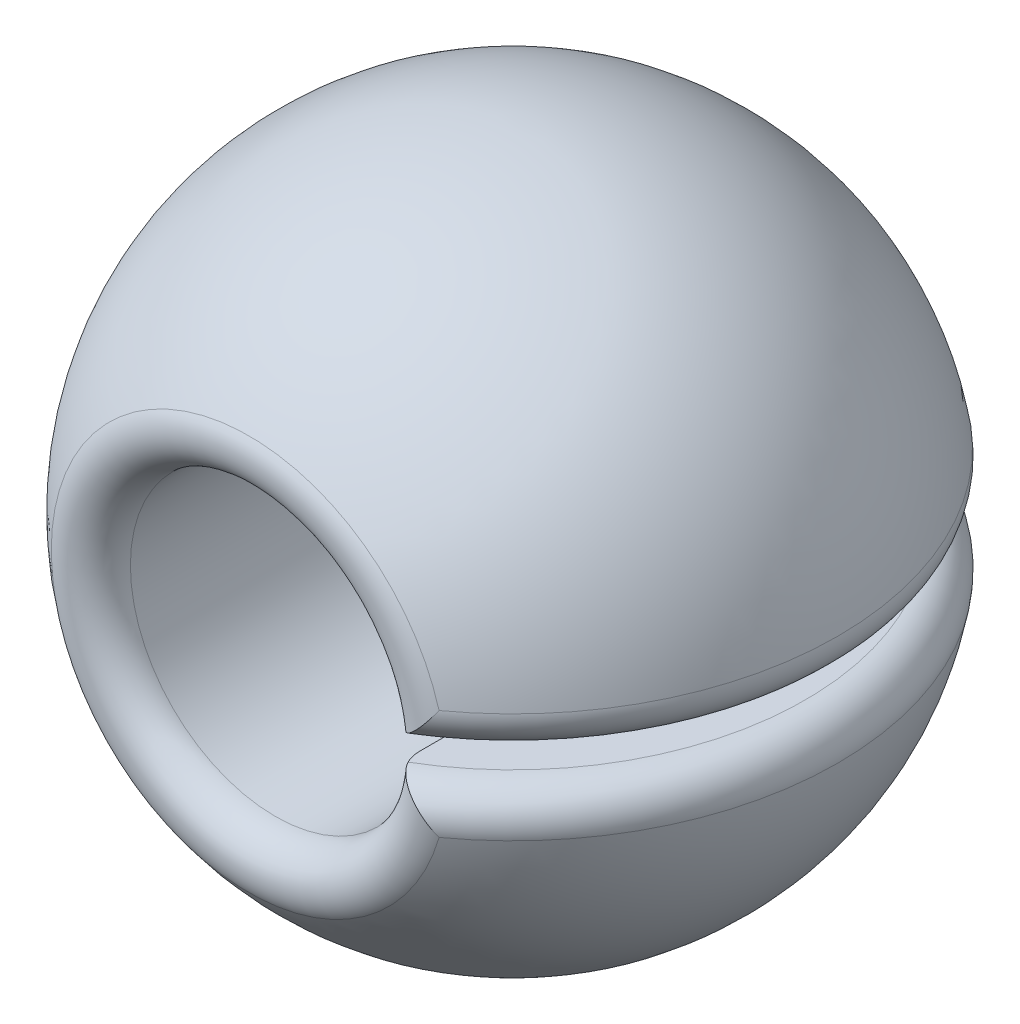
ISO-10303-21;
HEADER;
FILE_DESCRIPTION(('STEP AP214'),'2;1');
FILE_NAME('part.step','',(''),(''),'','','');
FILE_SCHEMA(('AUTOMOTIVE_DESIGN { 1 0 10303 214 1 1 1 1 }'));
ENDSEC;
DATA;
#1=APPLICATION_CONTEXT('core data for automotive mechanical design processes');
#2=APPLICATION_PROTOCOL_DEFINITION('international standard','automotive_design',2000,#1);
#3=PRODUCT_CONTEXT('',#1,'mechanical');
#4=PRODUCT('Part','Part','',(#3));
#5=PRODUCT_RELATED_PRODUCT_CATEGORY('part','',(#4));
#6=PRODUCT_DEFINITION_FORMATION('','',#4);
#7=PRODUCT_DEFINITION_CONTEXT('part definition',#1,'design');
#8=PRODUCT_DEFINITION('design','',#6,#7);
#9=PRODUCT_DEFINITION_SHAPE('','',#8);
#10=(LENGTH_UNIT() NAMED_UNIT(*) SI_UNIT(.MILLI.,.METRE.));
#11=(NAMED_UNIT(*) PLANE_ANGLE_UNIT() SI_UNIT($,.RADIAN.));
#12=(NAMED_UNIT(*) SI_UNIT($,.STERADIAN.) SOLID_ANGLE_UNIT());
#13=UNCERTAINTY_MEASURE_WITH_UNIT(LENGTH_MEASURE(1.E-05),#10,'distance_accuracy_value','');
#14=(GEOMETRIC_REPRESENTATION_CONTEXT(3) GLOBAL_UNCERTAINTY_ASSIGNED_CONTEXT((#13)) GLOBAL_UNIT_ASSIGNED_CONTEXT((#10,
#11,#12)) REPRESENTATION_CONTEXT('',''));
#15=CARTESIAN_POINT('',(0.,0.,0.));
#16=DIRECTION('',(0.,0.,1.));
#17=DIRECTION('',(1.,0.,0.));
#18=AXIS2_PLACEMENT_3D('',#15,#16,#17);
#19=CARTESIAN_POINT('',(0.,0.,0.));
#20=DIRECTION('',(0.,1.,0.));
#21=DIRECTION('',(1.,0.,0.));
#22=AXIS2_PLACEMENT_3D('',#19,#20,#21);
#23=SPHERICAL_SURFACE('',#22,10.);
#24=CARTESIAN_POINT('',(0.,-1.66666666666667,0.));
#25=DIRECTION('',(0.,1.,0.));
#26=DIRECTION('',(0.,0.,1.));
#27=AXIS2_PLACEMENT_3D('',#24,#25,#26);
#28=CIRCLE('',#27,9.86013297183269);
#29=CARTESIAN_POINT('',(5.76387215526353,-1.66666666666666,-8.));
#30=VERTEX_POINT('',#29);
#31=CARTESIAN_POINT('',(5.76387215526353,-1.66666666666667,8.));
#32=VERTEX_POINT('',#31);
#33=EDGE_CURVE('E183',#30,#32,#28,.F.);
#34=ORIENTED_EDGE('',*,*,#33,.T.);
#35=CARTESIAN_POINT('',(0.,0.,8.));
#36=DIRECTION('',(0.,0.,-1.));
#37=DIRECTION('',(-1.,0.,0.));
#38=AXIS2_PLACEMENT_3D('',#35,#36,#37);
#39=CIRCLE('',#38,6.);
#40=CARTESIAN_POINT('',(5.76387215526353,1.66666666666667,8.));
#41=VERTEX_POINT('',#40);
#42=EDGE_CURVE('E109',#32,#41,#39,.T.);
#43=ORIENTED_EDGE('',*,*,#42,.T.);
#44=CARTESIAN_POINT('',(0.,1.66666666666667,0.));
#45=DIRECTION('',(0.,-1.,0.));
#46=DIRECTION('',(0.,0.,-1.));
#47=AXIS2_PLACEMENT_3D('',#44,#45,#46);
#48=CIRCLE('',#47,9.86013297183269);
#49=CARTESIAN_POINT('',(5.76387215526353,1.66666666666667,-8.));
#50=VERTEX_POINT('',#49);
#51=EDGE_CURVE('E145',#41,#50,#48,.F.);
#52=ORIENTED_EDGE('',*,*,#51,.T.);
#53=CARTESIAN_POINT('',(0.,0.,-8.));
#54=DIRECTION('',(0.,0.,1.));
#55=DIRECTION('',(1.,0.,0.));
#56=AXIS2_PLACEMENT_3D('',#53,#54,#55);
#57=CIRCLE('',#56,6.);
#58=EDGE_CURVE('E182',#50,#30,#57,.T.);
#59=ORIENTED_EDGE('',*,*,#58,.T.);
#60=EDGE_LOOP('',(#34,#43,#52,#59));
#61=FACE_BOUND('',#60,.T.);
#62=ADVANCED_FACE('F33',(#61),#23,.T.);
#63=CARTESIAN_POINT('',(0.,0.,-15.));
#64=DIRECTION('',(0.,0.,1.));
#65=DIRECTION('',(1.,0.,0.));
#66=AXIS2_PLACEMENT_3D('',#63,#64,#65);
#67=CYLINDRICAL_SURFACE('',#66,4.4);
#68=DIRECTION('',(0.,0.,1.));
#69=VECTOR('',#68,1.);
#70=CARTESIAN_POINT('',(4.37149859887888,0.5,-15.));
#71=LINE('',#70,#69);
#72=CARTESIAN_POINT('',(4.37149859887888,0.5,-7.2));
#73=VERTEX_POINT('',#72);
#74=CARTESIAN_POINT('',(4.37149859887888,0.5,7.2));
#75=VERTEX_POINT('',#74);
#76=EDGE_CURVE('E94',#73,#75,#71,.T.);
#77=ORIENTED_EDGE('',*,*,#76,.T.);
#78=CARTESIAN_POINT('',(0.,0.,7.2));
#79=DIRECTION('',(0.,0.,-1.));
#80=DIRECTION('',(-1.,0.,0.));
#81=AXIS2_PLACEMENT_3D('',#78,#79,#80);
#82=CIRCLE('',#81,4.4);
#83=CARTESIAN_POINT('',(4.37149859887888,-0.5,7.2));
#84=VERTEX_POINT('',#83);
#85=EDGE_CURVE('E100',#75,#84,#82,.F.);
#86=ORIENTED_EDGE('',*,*,#85,.T.);
#87=DIRECTION('',(0.,0.,1.));
#88=VECTOR('',#87,1.);
#89=CARTESIAN_POINT('',(4.37149859887888,-0.5,-15.));
#90=LINE('',#89,#88);
#91=CARTESIAN_POINT('',(4.37149859887888,-0.5,-7.2));
#92=VERTEX_POINT('',#91);
#93=EDGE_CURVE('E97',#84,#92,#90,.F.);
#94=ORIENTED_EDGE('',*,*,#93,.T.);
#95=CARTESIAN_POINT('',(0.,0.,-7.2));
#96=DIRECTION('',(0.,0.,1.));
#97=DIRECTION('',(1.,0.,0.));
#98=AXIS2_PLACEMENT_3D('',#95,#96,#97);
#99=CIRCLE('',#98,4.4);
#100=EDGE_CURVE('E91',#92,#73,#99,.F.);
#101=ORIENTED_EDGE('',*,*,#100,.T.);
#102=EDGE_LOOP('',(#77,#86,#94,#101));
#103=FACE_BOUND('',#102,.T.);
#104=ADVANCED_FACE('F92',(#103),#67,.F.);
#105=CARTESIAN_POINT('',(1.43663209838354,-0.5,-15.));
#106=DIRECTION('',(0.,-1.,0.));
#107=DIRECTION('',(0.,0.,-1.));
#108=AXIS2_PLACEMENT_3D('',#105,#106,#107);
#109=PLANE('',#108);
#110=ORIENTED_EDGE('',*,*,#93,.F.);
#111=CARTESIAN_POINT('',(4.37149859887888,-0.5,7.2));
#112=CARTESIAN_POINT('',(4.3715000083011,-0.5,7.22827118414177));
#113=CARTESIAN_POINT('',(4.37270647832273,-0.5,7.25652365313391));
#114=CARTESIAN_POINT('',(4.37751985173512,-0.5,7.31282151715412));
#115=CARTESIAN_POINT('',(4.38112660510392,-0.5,7.34086692501313));
#116=CARTESIAN_POINT('',(4.39533532294747,-0.5,7.42329671445946));
#117=CARTESIAN_POINT('',(4.40932861969712,-0.5,7.47715178537061));
#118=CARTESIAN_POINT('',(4.43542649940364,-0.5,7.55150612071078));
#119=CARTESIAN_POINT('',(4.44396522602215,-0.5,7.57332808964728));
#120=CARTESIAN_POINT('',(4.46255567751384,-0.5,7.61631357401517));
#121=CARTESIAN_POINT('',(4.47260715294021,-0.5,7.6374771973124));
#122=CARTESIAN_POINT('',(4.48339485904466,-0.5,7.65827464497664));
#123=B_SPLINE_CURVE_WITH_KNOTS('',3,(#111,#112,#113,#114,#115,#116,#117,#118,#119,#120,#121,
#122),.UNSPECIFIED.,.F.,.F.,(4,2,2,2,2,4),(0.,0.0847505826996807,0.169495868835574,
0.335498168743905,0.405753588422414,0.475997435902578),.UNSPECIFIED.);
#124=CARTESIAN_POINT('',(4.48339485904466,-0.5,7.65827464497663));
#125=VERTEX_POINT('',#124);
#126=EDGE_CURVE('E140',#84,#125,#123,.T.);
#127=ORIENTED_EDGE('',*,*,#126,.T.);
#128=CARTESIAN_POINT('',(0.,-0.5,0.));
#129=DIRECTION('',(0.,-1.,0.));
#130=DIRECTION('',(0.,0.,-1.));
#131=AXIS2_PLACEMENT_3D('',#128,#129,#130);
#132=CIRCLE('',#131,8.87411967464942);
#133=CARTESIAN_POINT('',(4.48339485904466,-0.5,-7.65827464497663));
#134=VERTEX_POINT('',#133);
#135=EDGE_CURVE('E146',#125,#134,#132,.F.);
#136=ORIENTED_EDGE('',*,*,#135,.T.);
#137=CARTESIAN_POINT('',(4.48339485904466,-0.5,-7.65827464497663));
#138=CARTESIAN_POINT('',(4.47037990788513,-0.5,-7.63318475023888));
#139=CARTESIAN_POINT('',(4.45843738200139,-0.5,-7.60755924242167));
#140=CARTESIAN_POINT('',(4.43676487424644,-0.5,-7.55537660446647));
#141=CARTESIAN_POINT('',(4.4270358235886,-0.5,-7.52881908763367));
#142=CARTESIAN_POINT('',(4.40164332402976,-0.5,-7.44911335316665));
#143=CARTESIAN_POINT('',(4.38922781859914,-0.5,-7.39487266359291));
#144=CARTESIAN_POINT('',(4.37812898132568,-0.5,-7.31695927734273));
#145=CARTESIAN_POINT('',(4.37565665475817,-0.5,-7.29375869634919));
#146=CARTESIAN_POINT('',(4.37233539823856,-0.5,-7.24704420654527));
#147=CARTESIAN_POINT('',(4.37150038516548,-0.5,-7.2235293077698));
#148=CARTESIAN_POINT('',(4.37149859887887,-0.5,-7.2));
#149=B_SPLINE_CURVE_WITH_KNOTS('',3,(#137,#138,#139,#140,#141,#142,#143,#144,#145,#146,#147,
#148),.UNSPECIFIED.,.F.,.F.,(4,2,2,2,2,4),(0.,0.0847316911509409,0.169498963444771,
0.335500791361195,0.405453090543883,0.475997438023981),.UNSPECIFIED.);
#150=EDGE_CURVE('E133',#134,#92,#149,.T.);
#151=ORIENTED_EDGE('',*,*,#150,.T.);
#152=EDGE_LOOP('',(#110,#127,#136,#151));
#153=FACE_BOUND('',#152,.T.);
#154=ADVANCED_FACE('F124',(#153),#109,.F.);
#155=CARTESIAN_POINT('',(1.43663209838354,0.5,-15.));
#156=DIRECTION('',(0.,1.,0.));
#157=DIRECTION('',(0.,0.,1.));
#158=AXIS2_PLACEMENT_3D('',#155,#156,#157);
#159=PLANE('',#158);
#160=CARTESIAN_POINT('',(0.,0.5,0.));
#161=DIRECTION('',(0.,1.,0.));
#162=DIRECTION('',(0.,0.,1.));
#163=AXIS2_PLACEMENT_3D('',#160,#161,#162);
#164=CIRCLE('',#163,8.87411967464942);
#165=CARTESIAN_POINT('',(4.48339485904466,0.5,-7.65827464497663));
#166=VERTEX_POINT('',#165);
#167=CARTESIAN_POINT('',(4.48339485904466,0.5,7.65827464497663));
#168=VERTEX_POINT('',#167);
#169=EDGE_CURVE('E53',#166,#168,#164,.F.);
#170=ORIENTED_EDGE('',*,*,#169,.T.);
#171=CARTESIAN_POINT('',(4.48339485904467,0.5,7.65827464497664));
#172=CARTESIAN_POINT('',(4.47037990788514,0.5,7.63318475023889));
#173=CARTESIAN_POINT('',(4.45843738200139,0.5,7.60755924242168));
#174=CARTESIAN_POINT('',(4.43676487424644,0.5,7.55537660446648));
#175=CARTESIAN_POINT('',(4.4270358235886,0.5,7.52881908763368));
#176=CARTESIAN_POINT('',(4.40164332402976,0.5,7.44911335316667));
#177=CARTESIAN_POINT('',(4.38922781859914,0.5,7.39487266359292));
#178=CARTESIAN_POINT('',(4.37812898132568,0.5,7.31695927734274));
#179=CARTESIAN_POINT('',(4.37565665475817,0.5,7.2937586963492));
#180=CARTESIAN_POINT('',(4.37233539823856,0.5,7.24704420654527));
#181=CARTESIAN_POINT('',(4.37150038516548,0.5,7.2235293077698));
#182=CARTESIAN_POINT('',(4.37149859887887,0.5,7.2));
#183=B_SPLINE_CURVE_WITH_KNOTS('',3,(#171,#172,#173,#174,#175,#176,#177,#178,#179,#180,#181,
#182),.UNSPECIFIED.,.F.,.F.,(4,2,2,2,2,4),(0.,0.084731691150942,0.16949896344477,
0.335500791361195,0.40545309054389,0.475997438023992),.UNSPECIFIED.);
#184=EDGE_CURVE('E11',#168,#75,#183,.T.);
#185=ORIENTED_EDGE('',*,*,#184,.T.);
#186=ORIENTED_EDGE('',*,*,#76,.F.);
#187=CARTESIAN_POINT('',(4.37149859887888,0.5,-7.2));
#188=CARTESIAN_POINT('',(4.3715000083011,0.5,-7.22827118414177));
#189=CARTESIAN_POINT('',(4.37270647832273,0.5,-7.25652365313391));
#190=CARTESIAN_POINT('',(4.37751985173512,0.5,-7.31282151715412));
#191=CARTESIAN_POINT('',(4.38112660510392,0.5,-7.34086692501313));
#192=CARTESIAN_POINT('',(4.39533532294747,0.5,-7.42329671445946));
#193=CARTESIAN_POINT('',(4.40932861969712,0.5,-7.47715178537061));
#194=CARTESIAN_POINT('',(4.43542649940364,0.5,-7.55150612071078));
#195=CARTESIAN_POINT('',(4.44396522602215,0.5,-7.57332808964728));
#196=CARTESIAN_POINT('',(4.46255567751384,0.5,-7.61631357401517));
#197=CARTESIAN_POINT('',(4.47260715294021,0.5,-7.6374771973124));
#198=CARTESIAN_POINT('',(4.48339485904466,0.5,-7.65827464497664));
#199=B_SPLINE_CURVE_WITH_KNOTS('',3,(#187,#188,#189,#190,#191,#192,#193,#194,#195,#196,#197,
#198),.UNSPECIFIED.,.F.,.F.,(4,2,2,2,2,4),(0.,0.0847505826996807,0.169495868835574,
0.335498168743905,0.405753588422414,0.475997435902579),.UNSPECIFIED.);
#200=EDGE_CURVE('E46',#73,#166,#199,.T.);
#201=ORIENTED_EDGE('',*,*,#200,.T.);
#202=EDGE_LOOP('',(#170,#185,#186,#201));
#203=FACE_BOUND('',#202,.T.);
#204=ADVANCED_FACE('F102',(#203),#159,.F.);
#205=CARTESIAN_POINT('',(0.,0.,-7.2));
#206=DIRECTION('',(0.,0.,1.));
#207=DIRECTION('',(1.,0.,0.));
#208=AXIS2_PLACEMENT_3D('',#205,#206,#207);
#209=TOROIDAL_SURFACE('',#208,5.4,1.);
#210=CARTESIAN_POINT('',(4.48339485904467,-0.5,-7.65827464497664));
#211=CARTESIAN_POINT('',(4.49373872351533,-0.499997557961903,-7.67821850235973));
#212=CARTESIAN_POINT('',(4.5046895777925,-0.500755877428388,-7.69783452433855));
#213=CARTESIAN_POINT('',(4.52771192277276,-0.503778092128434,-7.73626480529823));
#214=CARTESIAN_POINT('',(4.53978289276623,-0.506041290774006,-7.75507943094893));
#215=CARTESIAN_POINT('',(4.57736622932614,-0.515021139792526,-7.80985976788924));
#216=CARTESIAN_POINT('',(4.60440375029733,-0.52392862651613,-7.84445897622241));
#217=CARTESIAN_POINT('',(4.6614249980411,-0.547067476274499,-7.90898122451794));
#218=CARTESIAN_POINT('',(4.69140450671643,-0.561291296894637,-7.93891080453233));
#219=CARTESIAN_POINT('',(4.75334559855569,-0.594343105748864,-7.99381785666063));
#220=CARTESIAN_POINT('',(4.7853099275231,-0.613177583272634,-8.01878825844671));
#221=CARTESIAN_POINT('',(4.85226934689621,-0.655943776364275,-8.06504521900316));
#222=CARTESIAN_POINT('',(4.88732979280035,-0.680118162396149,-8.08600973803219));
#223=CARTESIAN_POINT('',(4.95773821684433,-0.731921434918724,-8.1224057581348));
#224=CARTESIAN_POINT('',(4.99308628149768,-0.759551399661923,-8.13783552634836));
#225=CARTESIAN_POINT('',(5.07084441285223,-0.823684075729592,-8.16615222606326));
#226=CARTESIAN_POINT('',(5.11317009639791,-0.860828562207611,-8.17781482399603));
#227=CARTESIAN_POINT('',(5.19641539802074,-0.938110507829868,-8.19399025554618));
#228=CARTESIAN_POINT('',(5.23733408339478,-0.978249898482172,-8.19849843258407));
#229=CARTESIAN_POINT('',(5.3256499556881,-1.06950477174633,-8.20111943531343));
#230=CARTESIAN_POINT('',(5.3725648214125,-1.12113382934351,-8.19766112186229));
#231=CARTESIAN_POINT('',(5.46250899619843,-1.22637736203349,-8.18171748959355));
#232=CARTESIAN_POINT('',(5.50553483882934,-1.27999354947268,-8.16922420511558));
#233=CARTESIAN_POINT('',(5.58719571517369,-1.3884476785184,-8.13574489166365));
#234=CARTESIAN_POINT('',(5.62580151870938,-1.4432911736444,-8.11470609023634));
#235=CARTESIAN_POINT('',(5.69759516693416,-1.55278571254773,-8.06470963528962));
#236=CARTESIAN_POINT('',(5.73079403879581,-1.60743691984805,-8.03576842956435));
#237=CARTESIAN_POINT('',(5.76193886584751,-1.6631909205424,-8.00211083517878));
#238=CARTESIAN_POINT('',(5.76290708431499,-1.66492913315516,-8.00105731251424));
#239=CARTESIAN_POINT('',(5.76387215526353,-1.66666666666667,-8.));
#240=B_SPLINE_CURVE_WITH_KNOTS('',3,(#210,#211,#212,#213,#214,#215,#216,#217,#218,#219,#220,
#221,#222,#223,#224,#225,#226,#227,#228,#229,#230,#231,#232,#233,#234,#235,#236,#237,#238,#239),
.UNSPECIFIED.,.F.,.F.,(4,2,2,2,2,2,2,2,2,2,2,2,2,2,4),(0.,0.0673540461822489,0.134676936781279,
0.268332822560839,0.401799802775357,0.535455722749769,0.677352029247157,0.819292722974871,
0.991196168408916,1.16321145437523,1.37195694031646,1.58088669092636,1.79112678428043,
2.00093258345638,2.00768671692155),.UNSPECIFIED.);
#241=EDGE_CURVE('E169',#30,#134,#240,.F.);
#242=ORIENTED_EDGE('',*,*,#241,.F.);
#243=ORIENTED_EDGE('',*,*,#58,.F.);
#244=CARTESIAN_POINT('',(4.48339485904467,0.5,-7.65827464497664));
#245=CARTESIAN_POINT('',(4.49373872351532,0.499997557961903,-7.67821850235973));
#246=CARTESIAN_POINT('',(4.5046895777925,0.500755877428388,-7.69783452433855));
#247=CARTESIAN_POINT('',(4.52771192277276,0.503778092128434,-7.73626480529823));
#248=CARTESIAN_POINT('',(4.53978289276623,0.506041290774006,-7.75507943094893));
#249=CARTESIAN_POINT('',(4.57736622932614,0.515021139792526,-7.80985976788924));
#250=CARTESIAN_POINT('',(4.60440375029733,0.52392862651613,-7.84445897622241));
#251=CARTESIAN_POINT('',(4.6614249980411,0.547067476274499,-7.90898122451794));
#252=CARTESIAN_POINT('',(4.69140450671643,0.561291296894637,-7.93891080453233));
#253=CARTESIAN_POINT('',(4.75334559855569,0.594343105748865,-7.99381785666063));
#254=CARTESIAN_POINT('',(4.7853099275231,0.613177583272635,-8.01878825844671));
#255=CARTESIAN_POINT('',(4.85226934689621,0.655943776364274,-8.06504521900316));
#256=CARTESIAN_POINT('',(4.88732979280035,0.680118162396148,-8.08600973803219));
#257=CARTESIAN_POINT('',(4.95773821684433,0.731921434918723,-8.12240575813479));
#258=CARTESIAN_POINT('',(4.99308628149768,0.759551399661922,-8.13783552634836));
#259=CARTESIAN_POINT('',(5.07084441285223,0.823684075729594,-8.16615222606326));
#260=CARTESIAN_POINT('',(5.11317009639791,0.860828562207616,-8.17781482399603));
#261=CARTESIAN_POINT('',(5.19641539802075,0.938110507829868,-8.19399025554617));
#262=CARTESIAN_POINT('',(5.23733408339479,0.978249898482164,-8.19849843258406));
#263=CARTESIAN_POINT('',(5.32564995568808,1.06950477174633,-8.20111943531343));
#264=CARTESIAN_POINT('',(5.37256482141243,1.12113382934354,-8.19766112186232));
#265=CARTESIAN_POINT('',(5.46250899619847,1.22637736203342,-8.18171748959352));
#266=CARTESIAN_POINT('',(5.50553483882955,1.27999354947249,-8.16922420511547));
#267=CARTESIAN_POINT('',(5.58719571517348,1.38844767851861,-8.13574489166376));
#268=CARTESIAN_POINT('',(5.62580151870859,1.44329117364513,-8.11470609023676));
#269=CARTESIAN_POINT('',(5.69759516693499,1.55278571254703,-8.06470963528918));
#270=CARTESIAN_POINT('',(5.73079403879885,1.60743691984539,-8.03576842956274));
#271=CARTESIAN_POINT('',(5.7619388658477,1.66319092054223,-8.00211083517868));
#272=CARTESIAN_POINT('',(5.76290708431509,1.66492913315507,-8.00105731251418));
#273=CARTESIAN_POINT('',(5.76387215526353,1.66666666666667,-8.));
#274=B_SPLINE_CURVE_WITH_KNOTS('',3,(#244,#245,#246,#247,#248,#249,#250,#251,#252,#253,#254,
#255,#256,#257,#258,#259,#260,#261,#262,#263,#264,#265,#266,#267,#268,#269,#270,#271,#272,#273),
.UNSPECIFIED.,.F.,.F.,(4,2,2,2,2,2,2,2,2,2,2,2,2,2,4),(0.,0.0673540461822485,0.134676936781278,
0.268332822560839,0.401799802775359,0.535455722749769,0.677352029247154,0.819292722974871,
0.991196168408924,1.16321145437523,1.37195694031643,1.58088669092636,1.79112678428046,
2.00093258345637,2.00768671692155),.UNSPECIFIED.);
#275=EDGE_CURVE('E38',#166,#50,#274,.T.);
#276=ORIENTED_EDGE('',*,*,#275,.F.);
#277=ORIENTED_EDGE('',*,*,#200,.F.);
#278=ORIENTED_EDGE('',*,*,#100,.F.);
#279=ORIENTED_EDGE('',*,*,#150,.F.);
#280=EDGE_LOOP('',(#242,#243,#276,#277,#278,#279));
#281=FACE_BOUND('',#280,.T.);
#282=ADVANCED_FACE('F35',(#281),#209,.T.);
#283=CARTESIAN_POINT('',(0.,1.5,0.));
#284=DIRECTION('',(0.,1.,0.));
#285=DIRECTION('',(0.,0.,1.));
#286=AXIS2_PLACEMENT_3D('',#283,#284,#285);
#287=TOROIDAL_SURFACE('',#286,8.87411967464942,1.);
#288=ORIENTED_EDGE('',*,*,#275,.T.);
#289=ORIENTED_EDGE('',*,*,#51,.F.);
#290=CARTESIAN_POINT('',(4.48339485904467,0.5,7.65827464497664));
#291=CARTESIAN_POINT('',(4.49373872351533,0.499997557961903,7.67821850235973));
#292=CARTESIAN_POINT('',(4.5046895777925,0.500755877428388,7.69783452433855));
#293=CARTESIAN_POINT('',(4.52771192277276,0.503778092128434,7.73626480529823));
#294=CARTESIAN_POINT('',(4.53978289276623,0.506041290774006,7.75507943094893));
#295=CARTESIAN_POINT('',(4.57736622932614,0.515021139792526,7.80985976788924));
#296=CARTESIAN_POINT('',(4.60440375029733,0.52392862651613,7.84445897622241));
#297=CARTESIAN_POINT('',(4.6614249980411,0.547067476274499,7.90898122451794));
#298=CARTESIAN_POINT('',(4.69140450671643,0.561291296894637,7.93891080453233));
#299=CARTESIAN_POINT('',(4.75334559855569,0.594343105748864,7.99381785666063));
#300=CARTESIAN_POINT('',(4.7853099275231,0.613177583272635,8.01878825844671));
#301=CARTESIAN_POINT('',(4.85226934689621,0.655943776364275,8.06504521900316));
#302=CARTESIAN_POINT('',(4.88732979280035,0.680118162396148,8.08600973803219));
#303=CARTESIAN_POINT('',(4.95773821684433,0.731921434918723,8.1224057581348));
#304=CARTESIAN_POINT('',(4.99308628149768,0.759551399661922,8.13783552634836));
#305=CARTESIAN_POINT('',(5.07084441285223,0.823684075729594,8.16615222606326));
#306=CARTESIAN_POINT('',(5.11317009639791,0.860828562207615,8.17781482399603));
#307=CARTESIAN_POINT('',(5.19641539802075,0.938110507829869,8.19399025554617));
#308=CARTESIAN_POINT('',(5.23733408339479,0.978249898482167,8.19849843258406));
#309=CARTESIAN_POINT('',(5.32564995568809,1.06950477174633,8.20111943531343));
#310=CARTESIAN_POINT('',(5.37256482141246,1.12113382934353,8.19766112186231));
#311=CARTESIAN_POINT('',(5.46250899619846,1.22637736203345,8.18171748959353));
#312=CARTESIAN_POINT('',(5.50553483882948,1.27999354947256,8.16922420511551));
#313=CARTESIAN_POINT('',(5.58719571517355,1.38844767851853,8.13574489166372));
#314=CARTESIAN_POINT('',(5.62580151870888,1.44329117364486,8.11470609023661));
#315=CARTESIAN_POINT('',(5.6975951669347,1.55278571254728,8.06470963528934));
#316=CARTESIAN_POINT('',(5.73079403879776,1.60743691984634,8.03576842956332));
#317=CARTESIAN_POINT('',(5.76193886584764,1.66319092054229,8.00211083517872));
#318=CARTESIAN_POINT('',(5.76290708431505,1.66492913315511,8.0010573125142));
#319=CARTESIAN_POINT('',(5.76387215526353,1.66666666666667,8.));
#320=B_SPLINE_CURVE_WITH_KNOTS('',3,(#290,#291,#292,#293,#294,#295,#296,#297,#298,#299,#300,
#301,#302,#303,#304,#305,#306,#307,#308,#309,#310,#311,#312,#313,#314,#315,#316,#317,#318,#319),
.UNSPECIFIED.,.F.,.F.,(4,2,2,2,2,2,2,2,2,2,2,2,2,2,4),(0.,0.0673540461822481,0.134676936781278,
0.268332822560838,0.401799802775358,0.535455722749768,0.677352029247156,0.819292722974871,
0.991196168408922,1.16321145437523,1.37195694031644,1.58088669092636,1.79112678428045,
2.00093258345637,2.00768671692155),.UNSPECIFIED.);
#321=EDGE_CURVE('E165',#168,#41,#320,.T.);
#322=ORIENTED_EDGE('',*,*,#321,.F.);
#323=ORIENTED_EDGE('',*,*,#169,.F.);
#324=EDGE_LOOP('',(#288,#289,#322,#323));
#325=FACE_BOUND('',#324,.T.);
#326=ADVANCED_FACE('F155',(#325),#287,.T.);
#327=CARTESIAN_POINT('',(0.,-1.5,0.));
#328=DIRECTION('',(0.,-1.,0.));
#329=DIRECTION('',(0.,0.,-1.));
#330=AXIS2_PLACEMENT_3D('',#327,#328,#329);
#331=TOROIDAL_SURFACE('',#330,8.87411967464942,1.);
#332=ORIENTED_EDGE('',*,*,#241,.T.);
#333=ORIENTED_EDGE('',*,*,#135,.F.);
#334=CARTESIAN_POINT('',(4.48339485904467,-0.5,7.65827464497664));
#335=CARTESIAN_POINT('',(4.49373872351532,-0.499997557961903,7.67821850235973));
#336=CARTESIAN_POINT('',(4.5046895777925,-0.500755877428388,7.69783452433855));
#337=CARTESIAN_POINT('',(4.52771192277276,-0.503778092128434,7.73626480529822));
#338=CARTESIAN_POINT('',(4.53978289276623,-0.506041290774006,7.75507943094893));
#339=CARTESIAN_POINT('',(4.57736622932614,-0.515021139792526,7.80985976788924));
#340=CARTESIAN_POINT('',(4.60440375029733,-0.52392862651613,7.84445897622241));
#341=CARTESIAN_POINT('',(4.6614249980411,-0.547067476274498,7.90898122451794));
#342=CARTESIAN_POINT('',(4.69140450671643,-0.561291296894636,7.93891080453233));
#343=CARTESIAN_POINT('',(4.75334559855569,-0.594343105748863,7.99381785666062));
#344=CARTESIAN_POINT('',(4.7853099275231,-0.613177583272633,8.01878825844671));
#345=CARTESIAN_POINT('',(4.85226934689621,-0.655943776364273,8.06504521900316));
#346=CARTESIAN_POINT('',(4.88732979280034,-0.680118162396146,8.08600973803219));
#347=CARTESIAN_POINT('',(4.95773821684433,-0.731921434918721,8.12240575813479));
#348=CARTESIAN_POINT('',(4.99308628149768,-0.75955139966192,8.13783552634836));
#349=CARTESIAN_POINT('',(5.07084441285222,-0.823684075729593,8.16615222606326));
#350=CARTESIAN_POINT('',(5.11317009639791,-0.860828562207615,8.17781482399603));
#351=CARTESIAN_POINT('',(5.19641539802075,-0.938110507829866,8.19399025554617));
#352=CARTESIAN_POINT('',(5.23733408339479,-0.97824989848216,8.19849843258406));
#353=CARTESIAN_POINT('',(5.32564995568808,-1.06950477174633,8.20111943531343));
#354=CARTESIAN_POINT('',(5.37256482141243,-1.12113382934354,8.19766112186232));
#355=CARTESIAN_POINT('',(5.46250899619847,-1.22637736203342,8.18171748959352));
#356=CARTESIAN_POINT('',(5.50553483882956,-1.27999354947247,8.16922420511547));
#357=CARTESIAN_POINT('',(5.58719571517346,-1.38844767851861,8.13574489166377));
#358=CARTESIAN_POINT('',(5.62580151870854,-1.44329117364517,8.11470609023679));
#359=CARTESIAN_POINT('',(5.69759516693504,-1.55278571254699,8.06470963528916));
#360=CARTESIAN_POINT('',(5.73079403879903,-1.60743691984523,8.03576842956265));
#361=CARTESIAN_POINT('',(5.76193886584772,-1.66319092054222,8.00211083517867));
#362=CARTESIAN_POINT('',(5.7629070843151,-1.66492913315507,8.00105731251418));
#363=CARTESIAN_POINT('',(5.76387215526353,-1.66666666666667,8.));
#364=B_SPLINE_CURVE_WITH_KNOTS('',3,(#334,#335,#336,#337,#338,#339,#340,#341,#342,#343,#344,
#345,#346,#347,#348,#349,#350,#351,#352,#353,#354,#355,#356,#357,#358,#359,#360,#361,#362,#363),
.UNSPECIFIED.,.F.,.F.,(4,2,2,2,2,2,2,2,2,2,2,2,2,2,4),(0.,0.0673540461822481,0.134676936781279,
0.268332822560837,0.401799802775356,0.535455722749766,0.677352029247153,0.819292722974869,
0.991196168408921,1.16321145437522,1.37195694031642,1.58088669092636,1.79112678428047,
2.00093258345637,2.00768671692155),.UNSPECIFIED.);
#365=EDGE_CURVE('E159',#32,#125,#364,.F.);
#366=ORIENTED_EDGE('',*,*,#365,.F.);
#367=ORIENTED_EDGE('',*,*,#33,.F.);
#368=EDGE_LOOP('',(#332,#333,#366,#367));
#369=FACE_BOUND('',#368,.T.);
#370=ADVANCED_FACE('F152',(#369),#331,.T.);
#371=CARTESIAN_POINT('',(0.,0.,7.2));
#372=DIRECTION('',(0.,0.,-1.));
#373=DIRECTION('',(-1.,0.,0.));
#374=AXIS2_PLACEMENT_3D('',#371,#372,#373);
#375=TOROIDAL_SURFACE('',#374,5.4,1.);
#376=ORIENTED_EDGE('',*,*,#321,.T.);
#377=ORIENTED_EDGE('',*,*,#42,.F.);
#378=ORIENTED_EDGE('',*,*,#365,.T.);
#379=ORIENTED_EDGE('',*,*,#126,.F.);
#380=ORIENTED_EDGE('',*,*,#85,.F.);
#381=ORIENTED_EDGE('',*,*,#184,.F.);
#382=EDGE_LOOP('',(#376,#377,#378,#379,#380,#381));
#383=FACE_BOUND('',#382,.T.);
#384=ADVANCED_FACE('F148',(#383),#375,.T.);
#385=CLOSED_SHELL('',(#62,#104,#154,#204,#282,#326,#370,#384));
#386=MANIFOLD_SOLID_BREP('B2',#385);
#387=ADVANCED_BREP_SHAPE_REPRESENTATION('',(#18,#386),#14);
#388=SHAPE_DEFINITION_REPRESENTATION(#9,#387);
ENDSEC;
END-ISO-10303-21;
